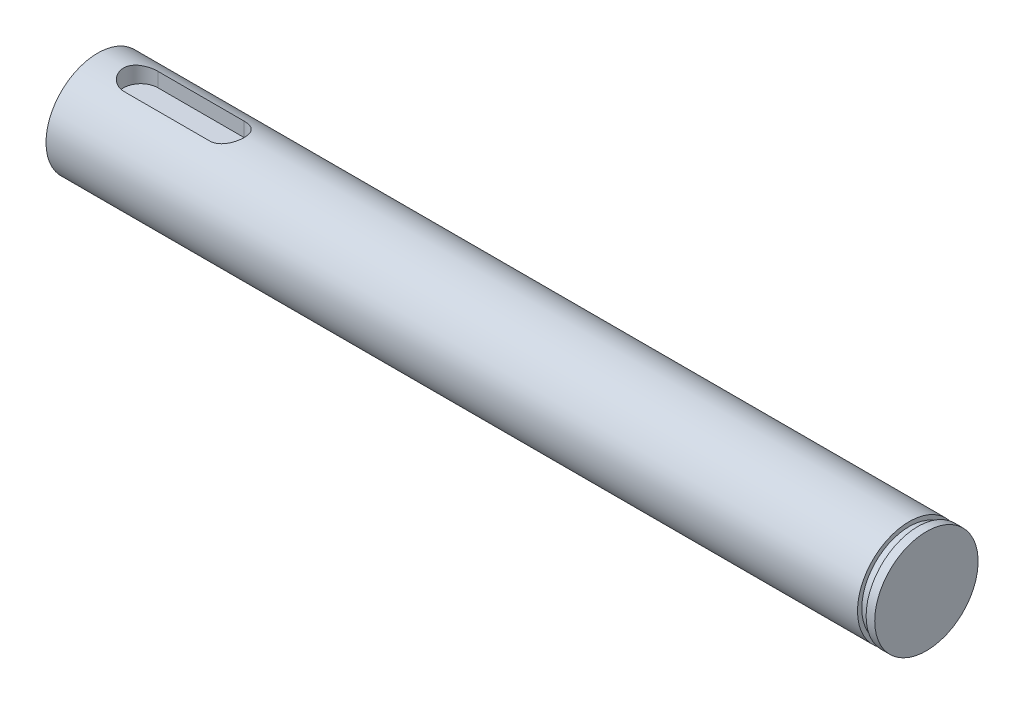
ISO-10303-21;
HEADER;
FILE_DESCRIPTION(('STEP AP214'),'2;1');
FILE_NAME('part.step','',(''),(''),'','','');
FILE_SCHEMA(('AUTOMOTIVE_DESIGN { 1 0 10303 214 1 1 1 1 }'));
ENDSEC;
DATA;
#1=APPLICATION_CONTEXT('core data for automotive mechanical design processes');
#2=APPLICATION_PROTOCOL_DEFINITION('international standard','automotive_design',2000,#1);
#3=PRODUCT_CONTEXT('',#1,'mechanical');
#4=PRODUCT('Part','Part','',(#3));
#5=PRODUCT_RELATED_PRODUCT_CATEGORY('part','',(#4));
#6=PRODUCT_DEFINITION_FORMATION('','',#4);
#7=PRODUCT_DEFINITION_CONTEXT('part definition',#1,'design');
#8=PRODUCT_DEFINITION('design','',#6,#7);
#9=PRODUCT_DEFINITION_SHAPE('','',#8);
#10=(LENGTH_UNIT() NAMED_UNIT(*) SI_UNIT(.MILLI.,.METRE.));
#11=(NAMED_UNIT(*) PLANE_ANGLE_UNIT() SI_UNIT($,.RADIAN.));
#12=(NAMED_UNIT(*) SI_UNIT($,.STERADIAN.) SOLID_ANGLE_UNIT());
#13=UNCERTAINTY_MEASURE_WITH_UNIT(LENGTH_MEASURE(1.E-05),#10,'distance_accuracy_value','');
#14=(GEOMETRIC_REPRESENTATION_CONTEXT(3) GLOBAL_UNCERTAINTY_ASSIGNED_CONTEXT((#13)) GLOBAL_UNIT_ASSIGNED_CONTEXT((#10,
#11,#12)) REPRESENTATION_CONTEXT('',''));
#15=CARTESIAN_POINT('',(0.,0.,0.));
#16=DIRECTION('',(0.,0.,1.));
#17=DIRECTION('',(1.,0.,0.));
#18=AXIS2_PLACEMENT_3D('',#15,#16,#17);
#19=CARTESIAN_POINT('',(0.,0.,0.));
#20=DIRECTION('',(-1.,0.,0.));
#21=DIRECTION('',(0.,0.,1.));
#22=AXIS2_PLACEMENT_3D('',#19,#20,#21);
#23=CYLINDRICAL_SURFACE('',#22,6.);
#24=CARTESIAN_POINT('',(96.2,0.,0.));
#25=DIRECTION('',(-1.,0.,0.));
#26=DIRECTION('',(0.,0.,1.));
#27=AXIS2_PLACEMENT_3D('',#24,#25,#26);
#28=CIRCLE('',#27,6.);
#29=CARTESIAN_POINT('',(96.2,0.,6.));
#30=VERTEX_POINT('',#29);
#31=EDGE_CURVE('E102',#30,#30,#28,.T.);
#32=ORIENTED_EDGE('',*,*,#31,.T.);
#33=EDGE_LOOP('',(#32));
#34=FACE_BOUND('',#33,.T.);
#35=CARTESIAN_POINT('',(95.2,0.,0.));
#36=DIRECTION('',(-1.,0.,0.));
#37=DIRECTION('',(0.,0.,1.));
#38=AXIS2_PLACEMENT_3D('',#35,#36,#37);
#39=CIRCLE('',#38,6.);
#40=CARTESIAN_POINT('',(95.2,0.,6.));
#41=VERTEX_POINT('',#40);
#42=EDGE_CURVE('E121',#41,#41,#39,.T.);
#43=ORIENTED_EDGE('',*,*,#42,.F.);
#44=EDGE_LOOP('',(#43));
#45=FACE_BOUND('',#44,.T.);
#46=ADVANCED_FACE('F37',(#34,#45),#23,.T.);
#47=CARTESIAN_POINT('',(95.2,0.,0.));
#48=DIRECTION('',(1.,0.,0.));
#49=DIRECTION('',(0.,0.,-1.));
#50=AXIS2_PLACEMENT_3D('',#47,#48,#49);
#51=PLANE('',#50);
#52=CARTESIAN_POINT('',(95.2,0.,0.));
#53=DIRECTION('',(-1.,0.,0.));
#54=DIRECTION('',(0.,0.,1.));
#55=AXIS2_PLACEMENT_3D('',#52,#53,#54);
#56=CIRCLE('',#55,5.5);
#57=CARTESIAN_POINT('',(95.2,0.,5.5));
#58=VERTEX_POINT('',#57);
#59=EDGE_CURVE('E118',#58,#58,#56,.T.);
#60=ORIENTED_EDGE('',*,*,#59,.F.);
#61=EDGE_LOOP('',(#60));
#62=FACE_BOUND('',#61,.T.);
#63=ORIENTED_EDGE('',*,*,#42,.T.);
#64=EDGE_LOOP('',(#63));
#65=FACE_BOUND('',#64,.T.);
#66=ADVANCED_FACE('F39',(#62,#65),#51,.F.);
#67=CARTESIAN_POINT('',(0.,0.,0.));
#68=DIRECTION('',(-1.,0.,0.));
#69=DIRECTION('',(0.,0.,1.));
#70=AXIS2_PLACEMENT_3D('',#67,#68,#69);
#71=CYLINDRICAL_SURFACE('',#70,5.5);
#72=ORIENTED_EDGE('',*,*,#59,.T.);
#73=EDGE_LOOP('',(#72));
#74=FACE_BOUND('',#73,.T.);
#75=CARTESIAN_POINT('',(94.2,0.,0.));
#76=DIRECTION('',(-1.,0.,0.));
#77=DIRECTION('',(0.,0.,1.));
#78=AXIS2_PLACEMENT_3D('',#75,#76,#77);
#79=CIRCLE('',#78,5.5);
#80=CARTESIAN_POINT('',(94.2,0.,5.5));
#81=VERTEX_POINT('',#80);
#82=EDGE_CURVE('E115',#81,#81,#79,.T.);
#83=ORIENTED_EDGE('',*,*,#82,.F.);
#84=EDGE_LOOP('',(#83));
#85=FACE_BOUND('',#84,.T.);
#86=ADVANCED_FACE('F173',(#74,#85),#71,.T.);
#87=CARTESIAN_POINT('',(94.2,0.,0.));
#88=DIRECTION('',(1.,0.,0.));
#89=DIRECTION('',(0.,0.,-1.));
#90=AXIS2_PLACEMENT_3D('',#87,#88,#89);
#91=PLANE('',#90);
#92=ORIENTED_EDGE('',*,*,#82,.T.);
#93=EDGE_LOOP('',(#92));
#94=FACE_BOUND('',#93,.T.);
#95=CARTESIAN_POINT('',(94.2,0.,0.));
#96=DIRECTION('',(-1.,0.,0.));
#97=DIRECTION('',(0.,0.,1.));
#98=AXIS2_PLACEMENT_3D('',#95,#96,#97);
#99=CIRCLE('',#98,6.);
#100=CARTESIAN_POINT('',(94.2,0.,6.));
#101=VERTEX_POINT('',#100);
#102=EDGE_CURVE('E112',#101,#101,#99,.T.);
#103=ORIENTED_EDGE('',*,*,#102,.F.);
#104=EDGE_LOOP('',(#103));
#105=FACE_BOUND('',#104,.T.);
#106=ADVANCED_FACE('F157',(#94,#105),#91,.T.);
#107=CARTESIAN_POINT('',(15.,5.65685424949238,2.));
#108=CARTESIAN_POINT('',(15.0545809936022,5.65684884188678,2.0000014949184));
#109=CARTESIAN_POINT('',(15.1091341243787,5.6576451988649,1.99776424917478));
#110=CARTESIAN_POINT('',(15.2178171681098,5.66078654578442,1.9888512140728));
#111=CARTESIAN_POINT('',(15.2719471913194,5.66313111768244,1.98217662286705));
#112=CARTESIAN_POINT('',(15.4327842863903,5.67238184449301,1.95562135046158));
#113=CARTESIAN_POINT('',(15.538361692541,5.6815058499903,1.92920846605623));
#114=CARTESIAN_POINT('',(15.7432503848876,5.70456149397718,1.85991682366086));
#115=CARTESIAN_POINT('',(15.8425650937458,5.71849047905858,1.81704715197507));
#116=CARTESIAN_POINT('',(16.0326796680109,5.74957574438921,1.71614645792974));
#117=CARTESIAN_POINT('',(16.1234742581347,5.76673400456216,1.65810612564547));
#118=CARTESIAN_POINT('',(16.2974404626491,5.80308960804095,1.52610278704603));
#119=CARTESIAN_POINT('',(16.3802297609252,5.82233755536618,1.45164996064407));
#120=CARTESIAN_POINT('',(16.5324120355834,5.86027697385956,1.28997688598297));
#121=CARTESIAN_POINT('',(16.6018026265119,5.87896834543705,1.20275436910907));
#122=CARTESIAN_POINT('',(16.7269590376084,5.91427765988454,1.01520729191253));
#123=CARTESIAN_POINT('',(16.7823219688045,5.93082875123708,0.914600178716994));
#124=CARTESIAN_POINT('',(16.8751845033745,5.95939217209317,0.704858499931718));
#125=CARTESIAN_POINT('',(16.9126895636409,5.97140588786619,0.59572655118684));
#126=CARTESIAN_POINT('',(16.9674714521827,5.98918142285845,0.376058690956074));
#127=CARTESIAN_POINT('',(16.9854065451074,5.99514617977147,0.265703668920224));
#128=CARTESIAN_POINT('',(17.0026325970512,6.00087216807634,0.0433979389113466));
#129=CARTESIAN_POINT('',(17.0019279985395,6.00063487762605,-0.0685523824907838));
#130=CARTESIAN_POINT('',(16.9823114337867,5.99412077270532,-0.286207690558783));
#131=CARTESIAN_POINT('',(16.9641147240811,5.98808121982527,-0.391985405251071));
#132=CARTESIAN_POINT('',(16.9112136026518,5.97093921001647,-0.598888128753311));
#133=CARTESIAN_POINT('',(16.8765082755875,5.95983647235462,-0.700012879232927));
#134=CARTESIAN_POINT('',(16.7911572607987,5.93351336542608,-0.896305246061924));
#135=CARTESIAN_POINT('',(16.7403079097553,5.91824075676625,-0.991377011307983));
#136=CARTESIAN_POINT('',(16.6242800972186,5.88516775360088,-1.17184917819498));
#137=CARTESIAN_POINT('',(16.559097737907,5.86736667195186,-1.25724693942937));
#138=CARTESIAN_POINT('',(16.4126579000063,5.83012543885479,-1.42019467942243));
#139=CARTESIAN_POINT('',(16.3307889127806,5.81064757359828,-1.4971872232254));
#140=CARTESIAN_POINT('',(16.1551170205677,5.77294980945702,-1.63654404964077));
#141=CARTESIAN_POINT('',(16.0613102751935,5.75473031831506,-1.69890360636763));
#142=CARTESIAN_POINT('',(15.8626396432934,5.72140062752635,-1.80800665118557));
#143=CARTESIAN_POINT('',(15.7576329701341,5.70634029896469,-1.85450601901537));
#144=CARTESIAN_POINT('',(15.5407060448201,5.68162194124078,-1.92892046140223));
#145=CARTESIAN_POINT('',(15.4287970132557,5.67195538817985,-1.95686487211071));
#146=CARTESIAN_POINT('',(15.263162726504,5.6627308418944,-1.98331631256166));
#147=CARTESIAN_POINT('',(15.2107172202915,5.66053335389204,-1.98957012251023));
#148=CARTESIAN_POINT('',(15.1055238432004,5.65759407142798,-1.99790923214239));
#149=CARTESIAN_POINT('',(15.0527764509112,5.65685039859056,-1.99999991078996));
#150=CARTESIAN_POINT('',(15.,5.65685424949238,-2.));
#151=B_SPLINE_CURVE_WITH_KNOTS('',3,(#107,#108,#109,#110,#111,#112,#113,#114,#115,#116,#117,
#118,#119,#120,#121,#122,#123,#124,#125,#126,#127,#128,#129,#130,#131,#132,#133,#134,#135,#136,
#137,#138,#139,#140,#141,#142,#143,#144,#145,#146,#147,#148,#149,#150),.UNSPECIFIED.,.F.,.F.,(4,
2,2,2,2,2,2,2,2,2,2,2,2,2,2,2,2,2,2,2,2,4),(0.,0.163636969470865,0.327229772338923,
0.653162396790745,0.97891532193247,1.30486862627062,1.64233009925355,1.97985159727495,
2.32618265866202,2.67240782242255,3.00658941454806,3.34069136061284,3.6616883693147,
3.98270317816496,4.30794037651935,4.63326613177537,4.97388108116101,5.31460588498485,
5.6603605985608,6.00556734973678,6.16399790665503,6.32222363058113),.UNSPECIFIED.);
#152=CARTESIAN_POINT('',(15.,5.65685424949238,2.));
#153=VERTEX_POINT('',#152);
#154=CARTESIAN_POINT('',(15.,5.65685424949238,-2.));
#155=VERTEX_POINT('',#154);
#156=EDGE_CURVE('E124',#153,#155,#151,.T.);
#157=ORIENTED_EDGE('',*,*,#156,.F.);
#158=DIRECTION('',(-1.,0.,0.));
#159=VECTOR('',#158,1.);
#160=CARTESIAN_POINT('',(0.,5.65685424949238,2.));
#161=LINE('',#160,#159);
#162=CARTESIAN_POINT('',(5.,5.65685424949238,2.));
#163=VERTEX_POINT('',#162);
#164=EDGE_CURVE('E11',#163,#153,#161,.F.);
#165=ORIENTED_EDGE('',*,*,#164,.F.);
#166=CARTESIAN_POINT('',(5.,5.65685424949238,-2.));
#167=CARTESIAN_POINT('',(4.94541900639777,5.65684884188678,-2.0000014949184));
#168=CARTESIAN_POINT('',(4.89086587562134,5.6576451988649,-1.99776424917478));
#169=CARTESIAN_POINT('',(4.78218283189021,5.66078654578442,-1.9888512140728));
#170=CARTESIAN_POINT('',(4.72805280868061,5.66313111768244,-1.98217662286705));
#171=CARTESIAN_POINT('',(4.56721571360972,5.67238184449301,-1.95562135046158));
#172=CARTESIAN_POINT('',(4.46163830745904,5.6815058499903,-1.92920846605623));
#173=CARTESIAN_POINT('',(4.25674961511244,5.70456149397718,-1.85991682366086));
#174=CARTESIAN_POINT('',(4.15743490625415,5.71849047905858,-1.81704715197507));
#175=CARTESIAN_POINT('',(3.96732033198908,5.74957574438921,-1.71614645792974));
#176=CARTESIAN_POINT('',(3.8765257418653,5.76673400456216,-1.65810612564547));
#177=CARTESIAN_POINT('',(3.70255953735094,5.80308960804095,-1.52610278704602));
#178=CARTESIAN_POINT('',(3.61977023907478,5.82233755536618,-1.45164996064407));
#179=CARTESIAN_POINT('',(3.46758796441661,5.86027697385956,-1.28997688598296));
#180=CARTESIAN_POINT('',(3.39819737348812,5.87896834543706,-1.20275436910907));
#181=CARTESIAN_POINT('',(3.2730409623916,5.91427765988454,-1.01520729191253));
#182=CARTESIAN_POINT('',(3.21767803119549,5.93082875123708,-0.914600178716992));
#183=CARTESIAN_POINT('',(3.12481549662547,5.95939217209316,-0.704858499931718));
#184=CARTESIAN_POINT('',(3.08731043635913,5.97140588786619,-0.59572655118684));
#185=CARTESIAN_POINT('',(3.03252854781725,5.98918142285845,-0.376058690956073));
#186=CARTESIAN_POINT('',(3.01459345489264,5.99514617977147,-0.265703668920224));
#187=CARTESIAN_POINT('',(2.99736740294878,6.00087216807633,-0.0433979389113456));
#188=CARTESIAN_POINT('',(2.9980720014605,6.00063487762605,0.0685523824907852));
#189=CARTESIAN_POINT('',(3.01768856621331,5.99412077270532,0.286207690558785));
#190=CARTESIAN_POINT('',(3.03588527591893,5.98808121982527,0.391985405251073));
#191=CARTESIAN_POINT('',(3.08878639734824,5.97093921001647,0.598888128753313));
#192=CARTESIAN_POINT('',(3.12349172441251,5.95983647235462,0.700012879232929));
#193=CARTESIAN_POINT('',(3.20884273920126,5.93351336542608,0.896305246061925));
#194=CARTESIAN_POINT('',(3.25969209024468,5.91824075676625,0.991377011307985));
#195=CARTESIAN_POINT('',(3.3757199027814,5.88516775360088,1.17184917819498));
#196=CARTESIAN_POINT('',(3.44090226209303,5.86736667195186,1.25724693942937));
#197=CARTESIAN_POINT('',(3.58734209999369,5.83012543885479,1.42019467942242));
#198=CARTESIAN_POINT('',(3.66921108721941,5.81064757359828,1.4971872232254));
#199=CARTESIAN_POINT('',(3.84488297943233,5.77294980945702,1.63654404964077));
#200=CARTESIAN_POINT('',(3.93868972480648,5.75473031831506,1.69890360636763));
#201=CARTESIAN_POINT('',(4.13736035670656,5.72140062752635,1.80800665118557));
#202=CARTESIAN_POINT('',(4.24236702986588,5.70634029896469,1.85450601901537));
#203=CARTESIAN_POINT('',(4.45929395517991,5.68162194124078,1.92892046140223));
#204=CARTESIAN_POINT('',(4.5712029867443,5.67195538817985,1.95686487211071));
#205=CARTESIAN_POINT('',(4.73683727349596,5.6627308418944,1.98331631256166));
#206=CARTESIAN_POINT('',(4.78928277970845,5.66053335389204,1.98957012251023));
#207=CARTESIAN_POINT('',(4.89447615679963,5.65759407142798,1.99790923214239));
#208=CARTESIAN_POINT('',(4.94722354908881,5.65685039859056,1.99999991078996));
#209=CARTESIAN_POINT('',(5.,5.65685424949238,2.));
#210=B_SPLINE_CURVE_WITH_KNOTS('',3,(#166,#167,#168,#169,#170,#171,#172,#173,#174,#175,#176,
#177,#178,#179,#180,#181,#182,#183,#184,#185,#186,#187,#188,#189,#190,#191,#192,#193,#194,#195,
#196,#197,#198,#199,#200,#201,#202,#203,#204,#205,#206,#207,#208,#209),.UNSPECIFIED.,.F.,.F.,(4,
2,2,2,2,2,2,2,2,2,2,2,2,2,2,2,2,2,2,2,2,4),(0.,0.163636969470865,0.327229772338923,
0.653162396790746,0.978915321932474,1.30486862627062,1.64233009925355,1.97985159727495,
2.32618265866203,2.67240782242254,3.00658941454806,3.34069136061285,3.6616883693147,
3.98270317816496,4.30794037651935,4.63326613177537,4.973881081161,5.31460588498485,
5.6603605985608,6.00556734973678,6.16399790665503,6.32222363058113),.UNSPECIFIED.);
#211=CARTESIAN_POINT('',(5.,5.65685424949238,-2.));
#212=VERTEX_POINT('',#211);
#213=EDGE_CURVE('E45',#212,#163,#210,.T.);
#214=ORIENTED_EDGE('',*,*,#213,.F.);
#215=DIRECTION('',(-1.,0.,0.));
#216=VECTOR('',#215,1.);
#217=CARTESIAN_POINT('',(0.,5.65685424949238,-2.));
#218=LINE('',#217,#216);
#219=EDGE_CURVE('E131',#155,#212,#218,.T.);
#220=ORIENTED_EDGE('',*,*,#219,.F.);
#221=EDGE_LOOP('',(#157,#165,#214,#220));
#222=FACE_BOUND('',#221,.T.);
#223=ORIENTED_EDGE('',*,*,#102,.T.);
#224=EDGE_LOOP('',(#223));
#225=FACE_BOUND('',#224,.T.);
#226=CARTESIAN_POINT('',(0.,0.,0.));
#227=DIRECTION('',(-1.,0.,0.));
#228=DIRECTION('',(0.,0.,1.));
#229=AXIS2_PLACEMENT_3D('',#226,#227,#228);
#230=CIRCLE('',#229,6.);
#231=CARTESIAN_POINT('',(0.,0.,6.));
#232=VERTEX_POINT('',#231);
#233=EDGE_CURVE('E109',#232,#232,#230,.T.);
#234=ORIENTED_EDGE('',*,*,#233,.F.);
#235=EDGE_LOOP('',(#234));
#236=FACE_BOUND('',#235,.T.);
#237=ADVANCED_FACE('F132',(#222,#225,#236),#23,.T.);
#238=CARTESIAN_POINT('',(0.,0.,0.));
#239=DIRECTION('',(-1.,0.,0.));
#240=DIRECTION('',(0.,0.,1.));
#241=AXIS2_PLACEMENT_3D('',#238,#239,#240);
#242=PLANE('',#241);
#243=ORIENTED_EDGE('',*,*,#233,.T.);
#244=EDGE_LOOP('',(#243));
#245=FACE_BOUND('',#244,.T.);
#246=ADVANCED_FACE('F156',(#245),#242,.T.);
#247=CARTESIAN_POINT('',(96.2,0.,0.));
#248=DIRECTION('',(-1.,0.,0.));
#249=DIRECTION('',(0.,0.,1.));
#250=AXIS2_PLACEMENT_3D('',#247,#248,#249);
#251=PLANE('',#250);
#252=ORIENTED_EDGE('',*,*,#31,.F.);
#253=EDGE_LOOP('',(#252));
#254=FACE_BOUND('',#253,.T.);
#255=ADVANCED_FACE('F149',(#254),#251,.F.);
#256=CARTESIAN_POINT('',(5.,4.,0.));
#257=DIRECTION('',(0.,1.,0.));
#258=DIRECTION('',(0.,0.,1.));
#259=AXIS2_PLACEMENT_3D('',#256,#257,#258);
#260=CYLINDRICAL_SURFACE('',#259,2.);
#261=DIRECTION('',(0.,1.,0.));
#262=VECTOR('',#261,1.);
#263=CARTESIAN_POINT('',(5.,4.,-2.));
#264=LINE('',#263,#262);
#265=CARTESIAN_POINT('',(5.,4.,-2.));
#266=VERTEX_POINT('',#265);
#267=EDGE_CURVE('E100',#266,#212,#264,.T.);
#268=ORIENTED_EDGE('',*,*,#267,.T.);
#269=ORIENTED_EDGE('',*,*,#213,.T.);
#270=DIRECTION('',(0.,1.,0.));
#271=VECTOR('',#270,1.);
#272=CARTESIAN_POINT('',(5.,4.,2.));
#273=LINE('',#272,#271);
#274=CARTESIAN_POINT('',(5.,4.,2.));
#275=VERTEX_POINT('',#274);
#276=EDGE_CURVE('E51',#275,#163,#273,.T.);
#277=ORIENTED_EDGE('',*,*,#276,.F.);
#278=CARTESIAN_POINT('',(5.,4.,0.));
#279=DIRECTION('',(0.,1.,0.));
#280=DIRECTION('',(0.,0.,1.));
#281=AXIS2_PLACEMENT_3D('',#278,#279,#280);
#282=CIRCLE('',#281,2.);
#283=EDGE_CURVE('E80',#266,#275,#282,.T.);
#284=ORIENTED_EDGE('',*,*,#283,.F.);
#285=EDGE_LOOP('',(#268,#269,#277,#284));
#286=FACE_BOUND('',#285,.T.);
#287=ADVANCED_FACE('F78',(#286),#260,.F.);
#288=CARTESIAN_POINT('',(5.,4.,-2.));
#289=DIRECTION('',(0.,0.,-1.));
#290=DIRECTION('',(-1.,0.,0.));
#291=AXIS2_PLACEMENT_3D('',#288,#289,#290);
#292=PLANE('',#291);
#293=ORIENTED_EDGE('',*,*,#219,.T.);
#294=ORIENTED_EDGE('',*,*,#267,.F.);
#295=DIRECTION('',(-1.,0.,0.));
#296=VECTOR('',#295,1.);
#297=CARTESIAN_POINT('',(5.,4.,-2.));
#298=LINE('',#297,#296);
#299=CARTESIAN_POINT('',(15.,4.,-2.));
#300=VERTEX_POINT('',#299);
#301=EDGE_CURVE('E83',#300,#266,#298,.T.);
#302=ORIENTED_EDGE('',*,*,#301,.F.);
#303=DIRECTION('',(0.,1.,0.));
#304=VECTOR('',#303,1.);
#305=CARTESIAN_POINT('',(15.,4.,-2.));
#306=LINE('',#305,#304);
#307=EDGE_CURVE('E103',#300,#155,#306,.T.);
#308=ORIENTED_EDGE('',*,*,#307,.T.);
#309=EDGE_LOOP('',(#293,#294,#302,#308));
#310=FACE_BOUND('',#309,.T.);
#311=ADVANCED_FACE('F141',(#310),#292,.F.);
#312=CARTESIAN_POINT('',(15.,4.,0.));
#313=DIRECTION('',(0.,1.,0.));
#314=DIRECTION('',(0.,0.,1.));
#315=AXIS2_PLACEMENT_3D('',#312,#313,#314);
#316=CYLINDRICAL_SURFACE('',#315,2.);
#317=DIRECTION('',(0.,1.,0.));
#318=VECTOR('',#317,1.);
#319=CARTESIAN_POINT('',(15.,4.,2.));
#320=LINE('',#319,#318);
#321=CARTESIAN_POINT('',(15.,4.,2.));
#322=VERTEX_POINT('',#321);
#323=EDGE_CURVE('E82',#322,#153,#320,.T.);
#324=ORIENTED_EDGE('',*,*,#323,.T.);
#325=ORIENTED_EDGE('',*,*,#156,.T.);
#326=ORIENTED_EDGE('',*,*,#307,.F.);
#327=CARTESIAN_POINT('',(15.,4.,0.));
#328=DIRECTION('',(0.,1.,0.));
#329=DIRECTION('',(0.,0.,1.));
#330=AXIS2_PLACEMENT_3D('',#327,#328,#329);
#331=CIRCLE('',#330,2.);
#332=EDGE_CURVE('E92',#322,#300,#331,.T.);
#333=ORIENTED_EDGE('',*,*,#332,.F.);
#334=EDGE_LOOP('',(#324,#325,#326,#333));
#335=FACE_BOUND('',#334,.T.);
#336=ADVANCED_FACE('F136',(#335),#316,.F.);
#337=CARTESIAN_POINT('',(5.,4.,2.));
#338=DIRECTION('',(0.,0.,1.));
#339=DIRECTION('',(1.,0.,0.));
#340=AXIS2_PLACEMENT_3D('',#337,#338,#339);
#341=PLANE('',#340);
#342=ORIENTED_EDGE('',*,*,#164,.T.);
#343=ORIENTED_EDGE('',*,*,#323,.F.);
#344=DIRECTION('',(1.,0.,0.));
#345=VECTOR('',#344,1.);
#346=CARTESIAN_POINT('',(5.,4.,2.));
#347=LINE('',#346,#345);
#348=EDGE_CURVE('E86',#275,#322,#347,.T.);
#349=ORIENTED_EDGE('',*,*,#348,.F.);
#350=ORIENTED_EDGE('',*,*,#276,.T.);
#351=EDGE_LOOP('',(#342,#343,#349,#350));
#352=FACE_BOUND('',#351,.T.);
#353=ADVANCED_FACE('F87',(#352),#341,.F.);
#354=CARTESIAN_POINT('',(5.,4.,0.));
#355=DIRECTION('',(0.,1.,0.));
#356=DIRECTION('',(0.,0.,1.));
#357=AXIS2_PLACEMENT_3D('',#354,#355,#356);
#358=PLANE('',#357);
#359=ORIENTED_EDGE('',*,*,#283,.T.);
#360=ORIENTED_EDGE('',*,*,#348,.T.);
#361=ORIENTED_EDGE('',*,*,#332,.T.);
#362=ORIENTED_EDGE('',*,*,#301,.T.);
#363=EDGE_LOOP('',(#359,#360,#361,#362));
#364=FACE_BOUND('',#363,.T.);
#365=ADVANCED_FACE('F94',(#364),#358,.T.);
#366=CLOSED_SHELL('',(#46,#66,#86,#106,#237,#246,#255,#287,#311,#336,#353,#365));
#367=MANIFOLD_SOLID_BREP('B2',#366);
#368=ADVANCED_BREP_SHAPE_REPRESENTATION('',(#18,#367),#14);
#369=SHAPE_DEFINITION_REPRESENTATION(#9,#368);
ENDSEC;
END-ISO-10303-21;
